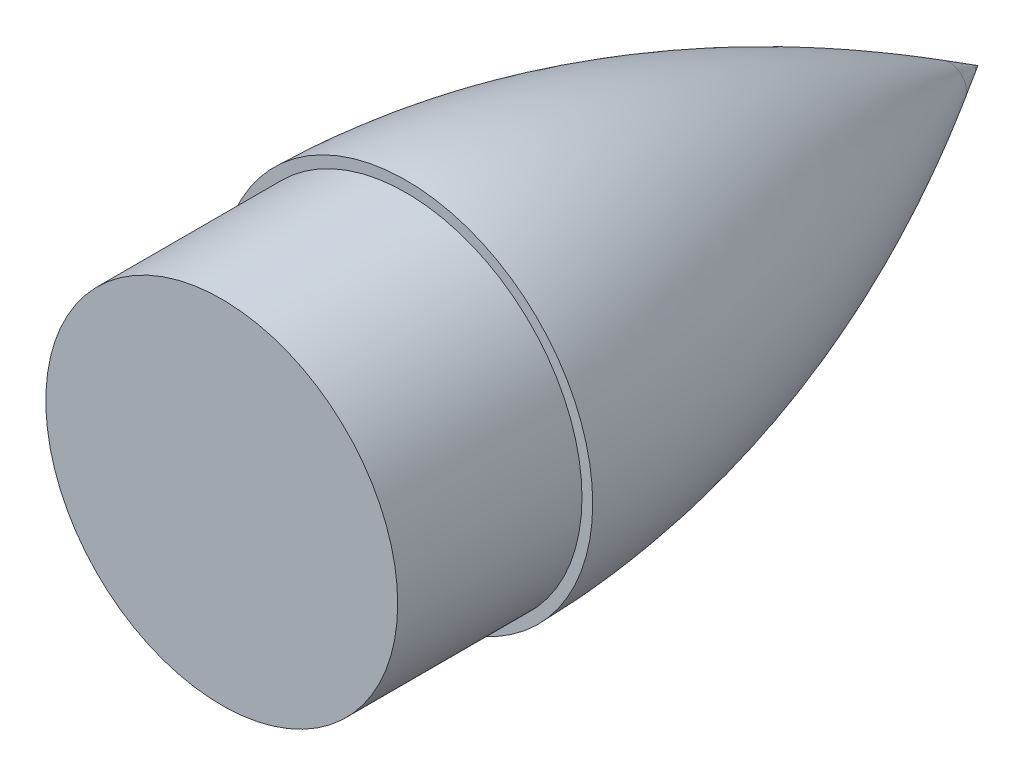
ISO-10303-21;
HEADER;
FILE_DESCRIPTION(('STEP AP214'),'2;1');
FILE_NAME('part.step','',(''),(''),'','','');
FILE_SCHEMA(('AUTOMOTIVE_DESIGN { 1 0 10303 214 1 1 1 1 }'));
ENDSEC;
DATA;
#1=APPLICATION_CONTEXT('core data for automotive mechanical design processes');
#2=APPLICATION_PROTOCOL_DEFINITION('international standard','automotive_design',2000,#1);
#3=PRODUCT_CONTEXT('',#1,'mechanical');
#4=PRODUCT('Part','Part','',(#3));
#5=PRODUCT_RELATED_PRODUCT_CATEGORY('part','',(#4));
#6=PRODUCT_DEFINITION_FORMATION('','',#4);
#7=PRODUCT_DEFINITION_CONTEXT('part definition',#1,'design');
#8=PRODUCT_DEFINITION('design','',#6,#7);
#9=PRODUCT_DEFINITION_SHAPE('','',#8);
#10=(LENGTH_UNIT() NAMED_UNIT(*) SI_UNIT(.MILLI.,.METRE.));
#11=(NAMED_UNIT(*) PLANE_ANGLE_UNIT() SI_UNIT($,.RADIAN.));
#12=(NAMED_UNIT(*) SI_UNIT($,.STERADIAN.) SOLID_ANGLE_UNIT());
#13=UNCERTAINTY_MEASURE_WITH_UNIT(LENGTH_MEASURE(1.E-05),#10,'distance_accuracy_value','');
#14=(GEOMETRIC_REPRESENTATION_CONTEXT(3) GLOBAL_UNCERTAINTY_ASSIGNED_CONTEXT((#13)) GLOBAL_UNIT_ASSIGNED_CONTEXT((#10,
#11,#12)) REPRESENTATION_CONTEXT('',''));
#15=CARTESIAN_POINT('',(0.,0.,0.));
#16=DIRECTION('',(0.,0.,1.));
#17=DIRECTION('',(1.,0.,0.));
#18=AXIS2_PLACEMENT_3D('',#15,#16,#17);
#19=CARTESIAN_POINT('',(-17.7660395733454,0.,20.));
#20=DIRECTION('',(0.,0.,-1.));
#21=DIRECTION('',(-1.,0.,0.));
#22=AXIS2_PLACEMENT_3D('',#19,#20,#21);
#23=PLANE('',#22);
#24=CARTESIAN_POINT('',(0.,0.,20.));
#25=DIRECTION('',(0.,0.,1.));
#26=DIRECTION('',(1.,0.,0.));
#27=AXIS2_PLACEMENT_3D('',#24,#25,#26);
#28=CIRCLE('',#27,21.);
#29=CARTESIAN_POINT('',(21.,0.,20.));
#30=VERTEX_POINT('',#29);
#31=EDGE_CURVE('E66',#30,#30,#28,.T.);
#32=ORIENTED_EDGE('',*,*,#31,.T.);
#33=EDGE_LOOP('',(#32));
#34=FACE_BOUND('',#33,.T.);
#35=ADVANCED_FACE('F37',(#34),#23,.F.);
#36=CARTESIAN_POINT('',(0.,0.,-70.2694212943739));
#37=DIRECTION('',(0.,0.,1.));
#38=DIRECTION('',(1.,0.,0.));
#39=AXIS2_PLACEMENT_3D('',#36,#37,#38);
#40=CONICAL_SURFACE('',#39,0.,0.535001451091537);
#41=CARTESIAN_POINT('',(0.,0.,-66.8947781543039));
#42=DIRECTION('',(0.,0.,1.));
#43=DIRECTION('',(1.,0.,0.));
#44=AXIS2_PLACEMENT_3D('',#41,#42,#43);
#45=CIRCLE('',#44,2.);
#46=CARTESIAN_POINT('',(2.,0.,-66.8947781543039));
#47=VERTEX_POINT('',#46);
#48=EDGE_CURVE('E11',#47,#47,#45,.T.);
#49=ORIENTED_EDGE('',*,*,#48,.F.);
#50=EDGE_LOOP('',(#49));
#51=FACE_BOUND('',#50,.T.);
#52=CARTESIAN_POINT('',(0.,0.,-70.2694212943739));
#53=VERTEX_POINT('',#52);
#54=VERTEX_LOOP('',#53);
#55=FACE_BOUND('',#54,.T.);
#56=ADVANCED_FACE('F46',(#51,#55),#40,.T.);
#57=CARTESIAN_POINT('',(-2.,0.,-66.8947781543039));
#58=CARTESIAN_POINT('',(-2.81323063787557,0.,-65.5225965576032));
#59=CARTESIAN_POINT('',(-4.41496773873803,0.,-62.7396234615826));
#60=CARTESIAN_POINT('',(-7.39199806896473,0.,-57.2347945715363));
#61=CARTESIAN_POINT('',(-10.7478226715479,0.,-50.3692105350747));
#62=CARTESIAN_POINT('',(-14.1727862263762,0.,-42.1867728200196));
#63=CARTESIAN_POINT('',(-17.9450441769586,0.,-31.3397584666966));
#64=CARTESIAN_POINT('',(-20.5261635892079,0.,-20.5955411540458));
#65=CARTESIAN_POINT('',(-21.9225433407315,0.,-9.93345651321782));
#66=CARTESIAN_POINT('',(-22.2259798022297,0.,-4.65246769555292));
#67=CARTESIAN_POINT('',(-22.27961817322,0.,-2.));
#68=B_SPLINE_CURVE_WITH_KNOTS('',3,(#57,#58,#59,#60,#61,#62,#63,#64,#65,#66,#67),.UNSPECIFIED.,
.F.,.F.,(4,1,1,1,1,1,1,1,4),(0.025818281819339,0.0819304767295193,0.1380426716397,
0.25026706146006,0.362491451280421,0.474715841100781,0.699164620741503,0.811389010561863,
0.923613400382224),.UNSPECIFIED.);
#69=CARTESIAN_POINT('',(0.,0.,20.));
#70=DIRECTION('',(0.,0.,1.));
#71=AXIS1_PLACEMENT('',#69,#70);
#72=SURFACE_OF_REVOLUTION('',#68,#71);
#73=CARTESIAN_POINT('',(0.,0.,-2.));
#74=DIRECTION('',(0.,0.,1.));
#75=DIRECTION('',(1.,0.,0.));
#76=AXIS2_PLACEMENT_3D('',#73,#74,#75);
#77=CIRCLE('',#76,22.27961817322);
#78=CARTESIAN_POINT('',(22.27961817322,0.,-2.));
#79=VERTEX_POINT('',#78);
#80=EDGE_CURVE('E43',#79,#79,#77,.T.);
#81=ORIENTED_EDGE('',*,*,#80,.F.);
#82=EDGE_LOOP('',(#81));
#83=FACE_BOUND('',#82,.T.);
#84=ORIENTED_EDGE('',*,*,#48,.T.);
#85=EDGE_LOOP('',(#84));
#86=FACE_BOUND('',#85,.T.);
#87=ADVANCED_FACE('F48',(#83,#86),#72,.T.);
#88=CARTESIAN_POINT('',(-22.27961817322,0.,-2.));
#89=DIRECTION('',(0.,0.,-1.));
#90=DIRECTION('',(-1.,0.,0.));
#91=AXIS2_PLACEMENT_3D('',#88,#89,#90);
#92=PLANE('',#91);
#93=CARTESIAN_POINT('',(0.,0.,-2.));
#94=DIRECTION('',(0.,0.,1.));
#95=DIRECTION('',(1.,0.,0.));
#96=AXIS2_PLACEMENT_3D('',#93,#94,#95);
#97=CIRCLE('',#96,21.);
#98=CARTESIAN_POINT('',(21.,0.,-2.));
#99=VERTEX_POINT('',#98);
#100=EDGE_CURVE('E72',#99,#99,#97,.T.);
#101=ORIENTED_EDGE('',*,*,#100,.F.);
#102=EDGE_LOOP('',(#101));
#103=FACE_BOUND('',#102,.T.);
#104=ORIENTED_EDGE('',*,*,#80,.T.);
#105=EDGE_LOOP('',(#104));
#106=FACE_BOUND('',#105,.T.);
#107=ADVANCED_FACE('F54',(#103,#106),#92,.F.);
#108=CARTESIAN_POINT('',(0.,0.,20.));
#109=DIRECTION('',(0.,0.,1.));
#110=DIRECTION('',(1.,0.,0.));
#111=AXIS2_PLACEMENT_3D('',#108,#109,#110);
#112=CYLINDRICAL_SURFACE('',#111,21.);
#113=ORIENTED_EDGE('',*,*,#31,.F.);
#114=EDGE_LOOP('',(#113));
#115=FACE_BOUND('',#114,.T.);
#116=ORIENTED_EDGE('',*,*,#100,.T.);
#117=EDGE_LOOP('',(#116));
#118=FACE_BOUND('',#117,.T.);
#119=ADVANCED_FACE('F79',(#115,#118),#112,.T.);
#120=CLOSED_SHELL('',(#35,#56,#87,#107,#119));
#121=MANIFOLD_SOLID_BREP('B2',#120);
#122=ADVANCED_BREP_SHAPE_REPRESENTATION('',(#18,#121),#14);
#123=SHAPE_DEFINITION_REPRESENTATION(#9,#122);
ENDSEC;
END-ISO-10303-21;
